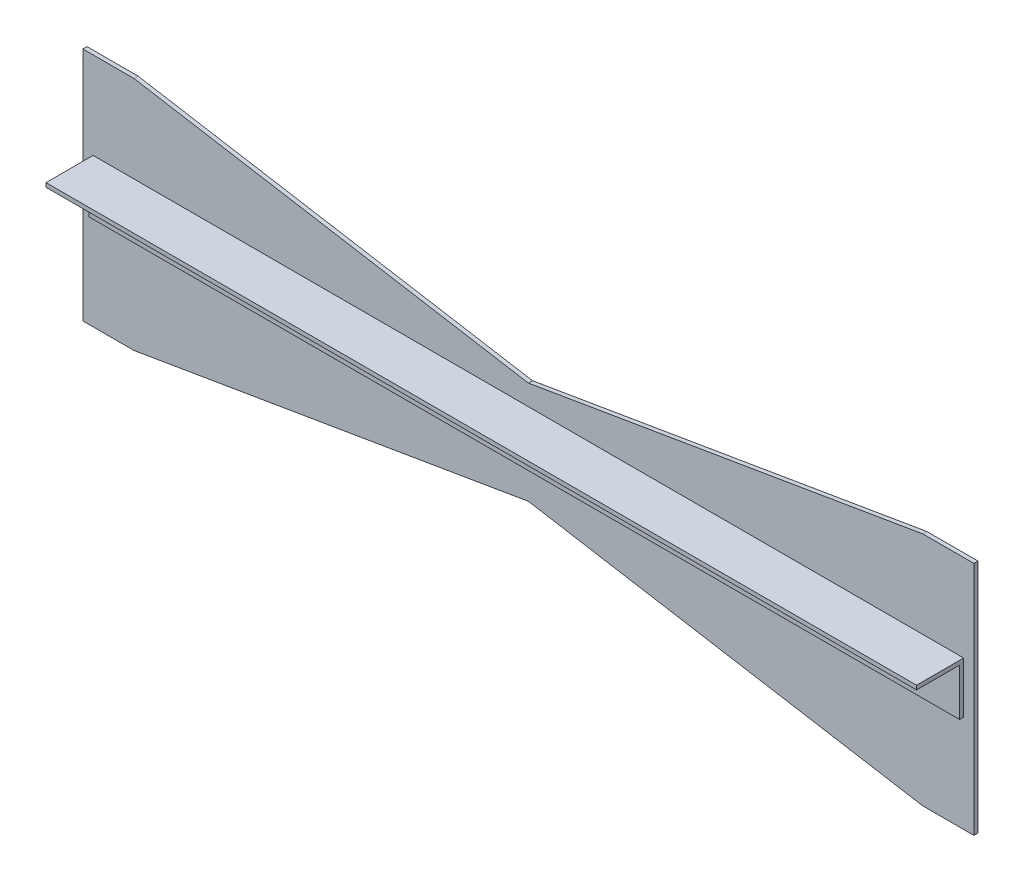
ISO-10303-21;
HEADER;
FILE_DESCRIPTION(('STEP AP214'),'2;1');
FILE_NAME('part.step','',(''),(''),'','','');
FILE_SCHEMA(('AUTOMOTIVE_DESIGN { 1 0 10303 214 1 1 1 1 }'));
ENDSEC;
DATA;
#1=APPLICATION_CONTEXT('core data for automotive mechanical design processes');
#2=APPLICATION_PROTOCOL_DEFINITION('international standard','automotive_design',2000,#1);
#3=PRODUCT_CONTEXT('',#1,'mechanical');
#4=PRODUCT('Part','Part','',(#3));
#5=PRODUCT_RELATED_PRODUCT_CATEGORY('part','',(#4));
#6=PRODUCT_DEFINITION_FORMATION('','',#4);
#7=PRODUCT_DEFINITION_CONTEXT('part definition',#1,'design');
#8=PRODUCT_DEFINITION('design','',#6,#7);
#9=PRODUCT_DEFINITION_SHAPE('','',#8);
#10=(LENGTH_UNIT() NAMED_UNIT(*) SI_UNIT(.MILLI.,.METRE.));
#11=(NAMED_UNIT(*) PLANE_ANGLE_UNIT() SI_UNIT($,.RADIAN.));
#12=(NAMED_UNIT(*) SI_UNIT($,.STERADIAN.) SOLID_ANGLE_UNIT());
#13=UNCERTAINTY_MEASURE_WITH_UNIT(LENGTH_MEASURE(1.E-05),#10,'distance_accuracy_value','');
#14=(GEOMETRIC_REPRESENTATION_CONTEXT(3) GLOBAL_UNCERTAINTY_ASSIGNED_CONTEXT((#13)) GLOBAL_UNIT_ASSIGNED_CONTEXT((#10,
#11,#12)) REPRESENTATION_CONTEXT('',''));
#15=CARTESIAN_POINT('',(0.,0.,0.));
#16=DIRECTION('',(0.,0.,1.));
#17=DIRECTION('',(1.,0.,0.));
#18=AXIS2_PLACEMENT_3D('',#15,#16,#17);
#19=CARTESIAN_POINT('',(-870.,0.,8.));
#20=DIRECTION('',(0.,0.,-1.));
#21=DIRECTION('',(-1.,0.,0.));
#22=AXIS2_PLACEMENT_3D('',#19,#20,#21);
#23=PLANE('',#22);
#24=DIRECTION('',(-1.,0.,0.));
#25=VECTOR('',#24,1.);
#26=CARTESIAN_POINT('',(0.,60.,8.));
#27=LINE('',#26,#25);
#28=CARTESIAN_POINT('',(849.999999999997,60.0000000000011,8.));
#29=VERTEX_POINT('',#28);
#30=CARTESIAN_POINT('',(-849.999999999997,60.0000000000011,8.));
#31=VERTEX_POINT('',#30);
#32=EDGE_CURVE('E233',#29,#31,#27,.T.);
#33=ORIENTED_EDGE('',*,*,#32,.F.);
#34=DIRECTION('',(0.,-1.,0.));
#35=VECTOR('',#34,1.);
#36=CARTESIAN_POINT('',(849.999999999997,60.0000000000011,8.));
#37=LINE('',#36,#35);
#38=CARTESIAN_POINT('',(849.999999999997,-39.999999999996,8.));
#39=VERTEX_POINT('',#38);
#40=EDGE_CURVE('E162',#29,#39,#37,.T.);
#41=ORIENTED_EDGE('',*,*,#40,.T.);
#42=DIRECTION('',(1.,0.,0.));
#43=VECTOR('',#42,1.);
#44=CARTESIAN_POINT('',(-849.999999999997,-39.999999999996,8.));
#45=LINE('',#44,#43);
#46=CARTESIAN_POINT('',(-849.999999999997,-39.999999999996,8.));
#47=VERTEX_POINT('',#46);
#48=EDGE_CURVE('E228',#47,#39,#45,.T.);
#49=ORIENTED_EDGE('',*,*,#48,.F.);
#50=DIRECTION('',(0.,-1.,0.));
#51=VECTOR('',#50,1.);
#52=CARTESIAN_POINT('',(-849.999999999997,60.0000000000011,8.));
#53=LINE('',#52,#51);
#54=EDGE_CURVE('E226',#31,#47,#53,.T.);
#55=ORIENTED_EDGE('',*,*,#54,.F.);
#56=EDGE_LOOP('',(#33,#41,#49,#55));
#57=FACE_BOUND('',#56,.T.);
#58=DIRECTION('',(-0.986045635560713,-0.166475237172591,0.));
#59=VECTOR('',#58,1.);
#60=CARTESIAN_POINT('',(-770.,-230.,8.));
#61=LINE('',#60,#59);
#62=CARTESIAN_POINT('',(1.74574168055479E-13,-99.9999999999972,8.));
#63=VERTEX_POINT('',#62);
#64=CARTESIAN_POINT('',(-770.,-230.,8.));
#65=VERTEX_POINT('',#64);
#66=EDGE_CURVE('E260',#63,#65,#61,.T.);
#67=ORIENTED_EDGE('',*,*,#66,.F.);
#68=DIRECTION('',(0.986045635560713,-0.166475237172591,0.));
#69=VECTOR('',#68,1.);
#70=CARTESIAN_POINT('',(770.,-230.,8.));
#71=LINE('',#70,#69);
#72=CARTESIAN_POINT('',(770.,-230.,8.));
#73=VERTEX_POINT('',#72);
#74=EDGE_CURVE('E180',#63,#73,#71,.T.);
#75=ORIENTED_EDGE('',*,*,#74,.T.);
#76=DIRECTION('',(1.,0.,0.));
#77=VECTOR('',#76,1.);
#78=CARTESIAN_POINT('',(870.,-230.,8.));
#79=LINE('',#78,#77);
#80=CARTESIAN_POINT('',(870.,-230.,8.));
#81=VERTEX_POINT('',#80);
#82=EDGE_CURVE('E182',#73,#81,#79,.T.);
#83=ORIENTED_EDGE('',*,*,#82,.T.);
#84=DIRECTION('',(0.,-1.,0.));
#85=VECTOR('',#84,1.);
#86=CARTESIAN_POINT('',(870.,0.,8.));
#87=LINE('',#86,#85);
#88=CARTESIAN_POINT('',(870.,230.,8.));
#89=VERTEX_POINT('',#88);
#90=EDGE_CURVE('E196',#89,#81,#87,.T.);
#91=ORIENTED_EDGE('',*,*,#90,.F.);
#92=DIRECTION('',(1.,0.,0.));
#93=VECTOR('',#92,1.);
#94=CARTESIAN_POINT('',(870.,230.,8.));
#95=LINE('',#94,#93);
#96=CARTESIAN_POINT('',(770.,230.,8.));
#97=VERTEX_POINT('',#96);
#98=EDGE_CURVE('E198',#97,#89,#95,.T.);
#99=ORIENTED_EDGE('',*,*,#98,.F.);
#100=DIRECTION('',(0.986045635560713,0.166475237172591,0.));
#101=VECTOR('',#100,1.);
#102=CARTESIAN_POINT('',(770.,230.,8.));
#103=LINE('',#102,#101);
#104=CARTESIAN_POINT('',(-1.74574168055479E-13,99.9999999999972,8.));
#105=VERTEX_POINT('',#104);
#106=EDGE_CURVE('E202',#105,#97,#103,.T.);
#107=ORIENTED_EDGE('',*,*,#106,.F.);
#108=DIRECTION('',(-0.986045635560713,0.166475237172591,0.));
#109=VECTOR('',#108,1.);
#110=CARTESIAN_POINT('',(-770.,230.,8.));
#111=LINE('',#110,#109);
#112=CARTESIAN_POINT('',(-770.,230.,8.));
#113=VERTEX_POINT('',#112);
#114=EDGE_CURVE('E273',#105,#113,#111,.T.);
#115=ORIENTED_EDGE('',*,*,#114,.T.);
#116=DIRECTION('',(-1.,0.,0.));
#117=VECTOR('',#116,1.);
#118=CARTESIAN_POINT('',(-870.,230.,8.));
#119=LINE('',#118,#117);
#120=CARTESIAN_POINT('',(-870.,230.,8.));
#121=VERTEX_POINT('',#120);
#122=EDGE_CURVE('E275',#113,#121,#119,.T.);
#123=ORIENTED_EDGE('',*,*,#122,.T.);
#124=DIRECTION('',(0.,-1.,0.));
#125=VECTOR('',#124,1.);
#126=CARTESIAN_POINT('',(-870.,0.,8.));
#127=LINE('',#126,#125);
#128=CARTESIAN_POINT('',(-870.,-230.,8.));
#129=VERTEX_POINT('',#128);
#130=EDGE_CURVE('E278',#121,#129,#127,.T.);
#131=ORIENTED_EDGE('',*,*,#130,.T.);
#132=DIRECTION('',(-1.,0.,0.));
#133=VECTOR('',#132,1.);
#134=CARTESIAN_POINT('',(-870.,-230.,8.));
#135=LINE('',#134,#133);
#136=EDGE_CURVE('E257',#65,#129,#135,.T.);
#137=ORIENTED_EDGE('',*,*,#136,.F.);
#138=EDGE_LOOP('',(#67,#75,#83,#91,#99,#107,#115,#123,#131,#137));
#139=FACE_BOUND('',#138,.T.);
#140=ADVANCED_FACE('F34',(#57,#139),#23,.F.);
#141=CARTESIAN_POINT('',(-770.,230.,8.));
#142=DIRECTION('',(-0.166475237172591,-0.986045635560712,0.));
#143=DIRECTION('',(0.986045635560712,-0.166475237172591,0.));
#144=AXIS2_PLACEMENT_3D('',#141,#142,#143);
#145=PLANE('',#144);
#146=DIRECTION('',(-0.986045635560713,0.166475237172591,0.));
#147=VECTOR('',#146,1.);
#148=CARTESIAN_POINT('',(-770.,230.,0.));
#149=LINE('',#148,#147);
#150=CARTESIAN_POINT('',(1.74574168055479E-13,99.9999999999972,0.));
#151=VERTEX_POINT('',#150);
#152=CARTESIAN_POINT('',(-770.,230.,0.));
#153=VERTEX_POINT('',#152);
#154=EDGE_CURVE('E272',#151,#153,#149,.T.);
#155=ORIENTED_EDGE('',*,*,#154,.T.);
#156=DIRECTION('',(0.,0.,-1.));
#157=VECTOR('',#156,1.);
#158=CARTESIAN_POINT('',(-770.,230.,8.));
#159=LINE('',#158,#157);
#160=EDGE_CURVE('E43',#113,#153,#159,.T.);
#161=ORIENTED_EDGE('',*,*,#160,.F.);
#162=ORIENTED_EDGE('',*,*,#114,.F.);
#163=DIRECTION('',(0.,0.,-1.));
#164=VECTOR('',#163,1.);
#165=CARTESIAN_POINT('',(-1.74574168055479E-13,99.9999999999972,8.));
#166=LINE('',#165,#164);
#167=EDGE_CURVE('E11',#105,#151,#166,.T.);
#168=ORIENTED_EDGE('',*,*,#167,.T.);
#169=EDGE_LOOP('',(#155,#161,#162,#168));
#170=FACE_BOUND('',#169,.T.);
#171=ADVANCED_FACE('F36',(#170),#145,.F.);
#172=CARTESIAN_POINT('',(-870.,230.,8.));
#173=DIRECTION('',(0.,-1.,0.));
#174=DIRECTION('',(0.,0.,-1.));
#175=AXIS2_PLACEMENT_3D('',#172,#173,#174);
#176=PLANE('',#175);
#177=DIRECTION('',(-1.,0.,0.));
#178=VECTOR('',#177,1.);
#179=CARTESIAN_POINT('',(-870.,230.,0.));
#180=LINE('',#179,#178);
#181=CARTESIAN_POINT('',(-870.,230.,0.));
#182=VERTEX_POINT('',#181);
#183=EDGE_CURVE('E282',#153,#182,#180,.T.);
#184=ORIENTED_EDGE('',*,*,#183,.T.);
#185=DIRECTION('',(0.,0.,-1.));
#186=VECTOR('',#185,1.);
#187=CARTESIAN_POINT('',(-870.,230.,8.));
#188=LINE('',#187,#186);
#189=EDGE_CURVE('E280',#121,#182,#188,.T.);
#190=ORIENTED_EDGE('',*,*,#189,.F.);
#191=ORIENTED_EDGE('',*,*,#122,.F.);
#192=ORIENTED_EDGE('',*,*,#160,.T.);
#193=EDGE_LOOP('',(#184,#190,#191,#192));
#194=FACE_BOUND('',#193,.T.);
#195=ADVANCED_FACE('F291',(#194),#176,.F.);
#196=CARTESIAN_POINT('',(-870.,0.,8.));
#197=DIRECTION('',(1.,0.,0.));
#198=DIRECTION('',(0.,0.,-1.));
#199=AXIS2_PLACEMENT_3D('',#196,#197,#198);
#200=PLANE('',#199);
#201=DIRECTION('',(0.,-1.,0.));
#202=VECTOR('',#201,1.);
#203=CARTESIAN_POINT('',(-870.,0.,0.));
#204=LINE('',#203,#202);
#205=CARTESIAN_POINT('',(-870.,-230.,0.));
#206=VERTEX_POINT('',#205);
#207=EDGE_CURVE('E276',#182,#206,#204,.T.);
#208=ORIENTED_EDGE('',*,*,#207,.T.);
#209=DIRECTION('',(0.,0.,-1.));
#210=VECTOR('',#209,1.);
#211=CARTESIAN_POINT('',(-870.,-230.,8.));
#212=LINE('',#211,#210);
#213=EDGE_CURVE('E269',#129,#206,#212,.T.);
#214=ORIENTED_EDGE('',*,*,#213,.F.);
#215=ORIENTED_EDGE('',*,*,#130,.F.);
#216=ORIENTED_EDGE('',*,*,#189,.T.);
#217=EDGE_LOOP('',(#208,#214,#215,#216));
#218=FACE_BOUND('',#217,.T.);
#219=ADVANCED_FACE('F303',(#218),#200,.F.);
#220=CARTESIAN_POINT('',(-870.,0.,0.));
#221=DIRECTION('',(0.,0.,-1.));
#222=DIRECTION('',(-1.,0.,0.));
#223=AXIS2_PLACEMENT_3D('',#220,#221,#222);
#224=PLANE('',#223);
#225=DIRECTION('',(0.986045635560713,-0.166475237172591,0.));
#226=VECTOR('',#225,1.);
#227=CARTESIAN_POINT('',(770.,-230.,0.));
#228=LINE('',#227,#226);
#229=CARTESIAN_POINT('',(1.74574168055479E-13,-99.9999999999972,0.));
#230=VERTEX_POINT('',#229);
#231=CARTESIAN_POINT('',(770.,-230.,0.));
#232=VERTEX_POINT('',#231);
#233=EDGE_CURVE('E179',#230,#232,#228,.T.);
#234=ORIENTED_EDGE('',*,*,#233,.F.);
#235=DIRECTION('',(-0.986045635560713,-0.166475237172591,0.));
#236=VECTOR('',#235,1.);
#237=CARTESIAN_POINT('',(-770.,-230.,0.));
#238=LINE('',#237,#236);
#239=CARTESIAN_POINT('',(-770.,-230.,0.));
#240=VERTEX_POINT('',#239);
#241=EDGE_CURVE('E254',#230,#240,#238,.T.);
#242=ORIENTED_EDGE('',*,*,#241,.T.);
#243=DIRECTION('',(-1.,0.,0.));
#244=VECTOR('',#243,1.);
#245=CARTESIAN_POINT('',(-870.,-230.,0.));
#246=LINE('',#245,#244);
#247=EDGE_CURVE('E251',#240,#206,#246,.T.);
#248=ORIENTED_EDGE('',*,*,#247,.T.);
#249=ORIENTED_EDGE('',*,*,#207,.F.);
#250=ORIENTED_EDGE('',*,*,#183,.F.);
#251=ORIENTED_EDGE('',*,*,#154,.F.);
#252=DIRECTION('',(0.986045635560713,0.166475237172591,0.));
#253=VECTOR('',#252,1.);
#254=CARTESIAN_POINT('',(770.,230.,0.));
#255=LINE('',#254,#253);
#256=CARTESIAN_POINT('',(770.,230.,0.));
#257=VERTEX_POINT('',#256);
#258=EDGE_CURVE('E199',#151,#257,#255,.T.);
#259=ORIENTED_EDGE('',*,*,#258,.T.);
#260=DIRECTION('',(1.,0.,0.));
#261=VECTOR('',#260,1.);
#262=CARTESIAN_POINT('',(870.,230.,0.));
#263=LINE('',#262,#261);
#264=CARTESIAN_POINT('',(870.,230.,0.));
#265=VERTEX_POINT('',#264);
#266=EDGE_CURVE('E207',#257,#265,#263,.T.);
#267=ORIENTED_EDGE('',*,*,#266,.T.);
#268=DIRECTION('',(0.,-1.,0.));
#269=VECTOR('',#268,1.);
#270=CARTESIAN_POINT('',(870.,0.,0.));
#271=LINE('',#270,#269);
#272=CARTESIAN_POINT('',(870.,-230.,0.));
#273=VERTEX_POINT('',#272);
#274=EDGE_CURVE('E195',#265,#273,#271,.T.);
#275=ORIENTED_EDGE('',*,*,#274,.T.);
#276=DIRECTION('',(1.,0.,0.));
#277=VECTOR('',#276,1.);
#278=CARTESIAN_POINT('',(870.,-230.,0.));
#279=LINE('',#278,#277);
#280=EDGE_CURVE('E183',#232,#273,#279,.T.);
#281=ORIENTED_EDGE('',*,*,#280,.F.);
#282=EDGE_LOOP('',(#234,#242,#248,#249,#250,#251,#259,#267,#275,#281));
#283=FACE_BOUND('',#282,.T.);
#284=ADVANCED_FACE('F299',(#283),#224,.T.);
#285=CARTESIAN_POINT('',(-870.,-230.,8.));
#286=DIRECTION('',(0.,-1.,0.));
#287=DIRECTION('',(0.,0.,-1.));
#288=AXIS2_PLACEMENT_3D('',#285,#286,#287);
#289=PLANE('',#288);
#290=ORIENTED_EDGE('',*,*,#247,.F.);
#291=DIRECTION('',(0.,0.,-1.));
#292=VECTOR('',#291,1.);
#293=CARTESIAN_POINT('',(-770.,-230.,8.));
#294=LINE('',#293,#292);
#295=EDGE_CURVE('E267',#65,#240,#294,.T.);
#296=ORIENTED_EDGE('',*,*,#295,.F.);
#297=ORIENTED_EDGE('',*,*,#136,.T.);
#298=ORIENTED_EDGE('',*,*,#213,.T.);
#299=EDGE_LOOP('',(#290,#296,#297,#298));
#300=FACE_BOUND('',#299,.T.);
#301=ADVANCED_FACE('F306',(#300),#289,.T.);
#302=CARTESIAN_POINT('',(-770.,-230.,8.));
#303=DIRECTION('',(0.166475237172591,-0.986045635560712,0.));
#304=DIRECTION('',(0.986045635560712,0.166475237172591,0.));
#305=AXIS2_PLACEMENT_3D('',#302,#303,#304);
#306=PLANE('',#305);
#307=ORIENTED_EDGE('',*,*,#241,.F.);
#308=DIRECTION('',(0.,0.,-1.));
#309=VECTOR('',#308,1.);
#310=CARTESIAN_POINT('',(-1.74574168055479E-13,-99.9999999999972,8.));
#311=LINE('',#310,#309);
#312=EDGE_CURVE('E262',#63,#230,#311,.T.);
#313=ORIENTED_EDGE('',*,*,#312,.F.);
#314=ORIENTED_EDGE('',*,*,#66,.T.);
#315=ORIENTED_EDGE('',*,*,#295,.T.);
#316=EDGE_LOOP('',(#307,#313,#314,#315));
#317=FACE_BOUND('',#316,.T.);
#318=ADVANCED_FACE('F313',(#317),#306,.T.);
#319=CARTESIAN_POINT('',(-849.999999999997,60.0000000000011,16.));
#320=DIRECTION('',(1.,0.,0.));
#321=DIRECTION('',(0.,0.,-1.));
#322=AXIS2_PLACEMENT_3D('',#319,#320,#321);
#323=PLANE('',#322);
#324=ORIENTED_EDGE('',*,*,#54,.T.);
#325=DIRECTION('',(0.,0.,-1.));
#326=VECTOR('',#325,1.);
#327=CARTESIAN_POINT('',(-849.999999999997,-39.999999999996,16.));
#328=LINE('',#327,#326);
#329=CARTESIAN_POINT('',(-849.999999999997,-39.999999999996,16.));
#330=VERTEX_POINT('',#329);
#331=EDGE_CURVE('E249',#330,#47,#328,.T.);
#332=ORIENTED_EDGE('',*,*,#331,.F.);
#333=DIRECTION('',(0.,-1.,0.));
#334=VECTOR('',#333,1.);
#335=CARTESIAN_POINT('',(-849.999999999997,60.0000000000011,16.));
#336=LINE('',#335,#334);
#337=CARTESIAN_POINT('',(-849.999999999997,52.0000000000006,16.));
#338=VERTEX_POINT('',#337);
#339=EDGE_CURVE('E224',#338,#330,#336,.T.);
#340=ORIENTED_EDGE('',*,*,#339,.F.);
#341=DIRECTION('',(0.,0.,-1.));
#342=VECTOR('',#341,1.);
#343=CARTESIAN_POINT('',(-849.999999999997,52.0000000000006,100.));
#344=LINE('',#343,#342);
#345=CARTESIAN_POINT('',(-849.999999999997,52.0000000000006,100.));
#346=VERTEX_POINT('',#345);
#347=EDGE_CURVE('E217',#346,#338,#344,.T.);
#348=ORIENTED_EDGE('',*,*,#347,.F.);
#349=DIRECTION('',(0.,-1.,0.));
#350=VECTOR('',#349,1.);
#351=CARTESIAN_POINT('',(-849.999999999997,60.0000000000011,100.));
#352=LINE('',#351,#350);
#353=CARTESIAN_POINT('',(-849.999999999997,60.0000000000011,100.));
#354=VERTEX_POINT('',#353);
#355=EDGE_CURVE('E155',#354,#346,#352,.T.);
#356=ORIENTED_EDGE('',*,*,#355,.F.);
#357=DIRECTION('',(0.,0.,-1.));
#358=VECTOR('',#357,1.);
#359=CARTESIAN_POINT('',(-849.999999999997,60.0000000000011,16.));
#360=LINE('',#359,#358);
#361=EDGE_CURVE('E239',#354,#31,#360,.T.);
#362=ORIENTED_EDGE('',*,*,#361,.T.);
#363=EDGE_LOOP('',(#324,#332,#340,#348,#356,#362));
#364=FACE_BOUND('',#363,.T.);
#365=ADVANCED_FACE('F369',(#364),#323,.F.);
#366=CARTESIAN_POINT('',(-849.999999999997,-39.999999999996,16.));
#367=DIRECTION('',(0.,1.,0.));
#368=DIRECTION('',(-1.,0.,0.));
#369=AXIS2_PLACEMENT_3D('',#366,#367,#368);
#370=PLANE('',#369);
#371=ORIENTED_EDGE('',*,*,#48,.T.);
#372=DIRECTION('',(0.,0.,-1.));
#373=VECTOR('',#372,1.);
#374=CARTESIAN_POINT('',(849.999999999997,-39.999999999996,16.));
#375=LINE('',#374,#373);
#376=CARTESIAN_POINT('',(849.999999999997,-39.999999999996,16.));
#377=VERTEX_POINT('',#376);
#378=EDGE_CURVE('E173',#377,#39,#375,.T.);
#379=ORIENTED_EDGE('',*,*,#378,.F.);
#380=DIRECTION('',(1.,0.,0.));
#381=VECTOR('',#380,1.);
#382=CARTESIAN_POINT('',(-849.999999999997,-39.999999999996,16.));
#383=LINE('',#382,#381);
#384=EDGE_CURVE('E236',#330,#377,#383,.T.);
#385=ORIENTED_EDGE('',*,*,#384,.F.);
#386=ORIENTED_EDGE('',*,*,#331,.T.);
#387=EDGE_LOOP('',(#371,#379,#385,#386));
#388=FACE_BOUND('',#387,.T.);
#389=ADVANCED_FACE('F375',(#388),#370,.F.);
#390=CARTESIAN_POINT('',(0.,60.,16.));
#391=DIRECTION('',(0.,-1.,0.));
#392=DIRECTION('',(1.,0.,0.));
#393=AXIS2_PLACEMENT_3D('',#390,#391,#392);
#394=PLANE('',#393);
#395=ORIENTED_EDGE('',*,*,#32,.T.);
#396=ORIENTED_EDGE('',*,*,#361,.F.);
#397=DIRECTION('',(-1.,0.,0.));
#398=VECTOR('',#397,1.);
#399=CARTESIAN_POINT('',(-1.04744500833291E-13,60.0000000000006,100.));
#400=LINE('',#399,#398);
#401=CARTESIAN_POINT('',(849.999999999997,60.0000000000011,100.));
#402=VERTEX_POINT('',#401);
#403=EDGE_CURVE('E157',#402,#354,#400,.T.);
#404=ORIENTED_EDGE('',*,*,#403,.F.);
#405=DIRECTION('',(0.,0.,-1.));
#406=VECTOR('',#405,1.);
#407=CARTESIAN_POINT('',(849.999999999997,60.0000000000011,16.));
#408=LINE('',#407,#406);
#409=EDGE_CURVE('E168',#402,#29,#408,.T.);
#410=ORIENTED_EDGE('',*,*,#409,.T.);
#411=EDGE_LOOP('',(#395,#396,#404,#410));
#412=FACE_BOUND('',#411,.T.);
#413=ADVANCED_FACE('F381',(#412),#394,.F.);
#414=CARTESIAN_POINT('',(-849.999999999997,-39.999999999996,16.));
#415=DIRECTION('',(0.,0.,1.));
#416=DIRECTION('',(1.,0.,0.));
#417=AXIS2_PLACEMENT_3D('',#414,#415,#416);
#418=PLANE('',#417);
#419=DIRECTION('',(0.,-1.,0.));
#420=VECTOR('',#419,1.);
#421=CARTESIAN_POINT('',(849.999999999997,60.0000000000011,16.));
#422=LINE('',#421,#420);
#423=CARTESIAN_POINT('',(849.999999999997,52.0000000000006,16.));
#424=VERTEX_POINT('',#423);
#425=EDGE_CURVE('E171',#424,#377,#422,.T.);
#426=ORIENTED_EDGE('',*,*,#425,.F.);
#427=DIRECTION('',(1.,0.,0.));
#428=VECTOR('',#427,1.);
#429=CARTESIAN_POINT('',(-849.999999999997,52.0000000000006,16.));
#430=LINE('',#429,#428);
#431=EDGE_CURVE('E51',#338,#424,#430,.T.);
#432=ORIENTED_EDGE('',*,*,#431,.F.);
#433=ORIENTED_EDGE('',*,*,#339,.T.);
#434=ORIENTED_EDGE('',*,*,#384,.T.);
#435=EDGE_LOOP('',(#426,#432,#433,#434));
#436=FACE_BOUND('',#435,.T.);
#437=ADVANCED_FACE('F388',(#436),#418,.T.);
#438=CARTESIAN_POINT('',(-849.999999999997,52.0000000000006,100.));
#439=DIRECTION('',(0.,1.,0.));
#440=DIRECTION('',(0.,0.,1.));
#441=AXIS2_PLACEMENT_3D('',#438,#439,#440);
#442=PLANE('',#441);
#443=ORIENTED_EDGE('',*,*,#431,.T.);
#444=DIRECTION('',(0.,0.,-1.));
#445=VECTOR('',#444,1.);
#446=CARTESIAN_POINT('',(849.999999999997,52.0000000000006,100.));
#447=LINE('',#446,#445);
#448=CARTESIAN_POINT('',(849.999999999997,52.0000000000006,100.));
#449=VERTEX_POINT('',#448);
#450=EDGE_CURVE('E159',#449,#424,#447,.T.);
#451=ORIENTED_EDGE('',*,*,#450,.F.);
#452=DIRECTION('',(1.,0.,0.));
#453=VECTOR('',#452,1.);
#454=CARTESIAN_POINT('',(-849.999999999997,52.0000000000006,100.));
#455=LINE('',#454,#453);
#456=EDGE_CURVE('E149',#346,#449,#455,.T.);
#457=ORIENTED_EDGE('',*,*,#456,.F.);
#458=ORIENTED_EDGE('',*,*,#347,.T.);
#459=EDGE_LOOP('',(#443,#451,#457,#458));
#460=FACE_BOUND('',#459,.T.);
#461=ADVANCED_FACE('F160',(#460),#442,.F.);
#462=CARTESIAN_POINT('',(0.,52.0000000000006,100.));
#463=DIRECTION('',(0.,0.,1.));
#464=DIRECTION('',(1.,0.,0.));
#465=AXIS2_PLACEMENT_3D('',#462,#463,#464);
#466=PLANE('',#465);
#467=ORIENTED_EDGE('',*,*,#456,.T.);
#468=DIRECTION('',(0.,-1.,0.));
#469=VECTOR('',#468,1.);
#470=CARTESIAN_POINT('',(849.999999999997,60.0000000000011,100.));
#471=LINE('',#470,#469);
#472=EDGE_CURVE('E153',#402,#449,#471,.T.);
#473=ORIENTED_EDGE('',*,*,#472,.F.);
#474=ORIENTED_EDGE('',*,*,#403,.T.);
#475=ORIENTED_EDGE('',*,*,#355,.T.);
#476=EDGE_LOOP('',(#467,#473,#474,#475));
#477=FACE_BOUND('',#476,.T.);
#478=ADVANCED_FACE('F150',(#477),#466,.T.);
#479=CARTESIAN_POINT('',(870.,0.,8.));
#480=DIRECTION('',(1.,0.,0.));
#481=DIRECTION('',(0.,0.,-1.));
#482=AXIS2_PLACEMENT_3D('',#479,#480,#481);
#483=PLANE('',#482);
#484=ORIENTED_EDGE('',*,*,#274,.F.);
#485=DIRECTION('',(0.,0.,-1.));
#486=VECTOR('',#485,1.);
#487=CARTESIAN_POINT('',(870.,230.,8.));
#488=LINE('',#487,#486);
#489=EDGE_CURVE('E213',#89,#265,#488,.T.);
#490=ORIENTED_EDGE('',*,*,#489,.F.);
#491=ORIENTED_EDGE('',*,*,#90,.T.);
#492=DIRECTION('',(0.,0.,-1.));
#493=VECTOR('',#492,1.);
#494=CARTESIAN_POINT('',(870.,-230.,8.));
#495=LINE('',#494,#493);
#496=EDGE_CURVE('E186',#81,#273,#495,.T.);
#497=ORIENTED_EDGE('',*,*,#496,.T.);
#498=EDGE_LOOP('',(#484,#490,#491,#497));
#499=FACE_BOUND('',#498,.T.);
#500=ADVANCED_FACE('F324',(#499),#483,.T.);
#501=CARTESIAN_POINT('',(870.,230.,8.));
#502=DIRECTION('',(0.,1.,0.));
#503=DIRECTION('',(0.,0.,1.));
#504=AXIS2_PLACEMENT_3D('',#501,#502,#503);
#505=PLANE('',#504);
#506=ORIENTED_EDGE('',*,*,#266,.F.);
#507=DIRECTION('',(0.,0.,-1.));
#508=VECTOR('',#507,1.);
#509=CARTESIAN_POINT('',(770.,230.,8.));
#510=LINE('',#509,#508);
#511=EDGE_CURVE('E205',#97,#257,#510,.T.);
#512=ORIENTED_EDGE('',*,*,#511,.F.);
#513=ORIENTED_EDGE('',*,*,#98,.T.);
#514=ORIENTED_EDGE('',*,*,#489,.T.);
#515=EDGE_LOOP('',(#506,#512,#513,#514));
#516=FACE_BOUND('',#515,.T.);
#517=ADVANCED_FACE('F329',(#516),#505,.T.);
#518=CARTESIAN_POINT('',(770.,230.,8.));
#519=DIRECTION('',(-0.166475237172591,0.986045635560712,0.));
#520=DIRECTION('',(-0.986045635560712,-0.166475237172591,0.));
#521=AXIS2_PLACEMENT_3D('',#518,#519,#520);
#522=PLANE('',#521);
#523=ORIENTED_EDGE('',*,*,#258,.F.);
#524=ORIENTED_EDGE('',*,*,#167,.F.);
#525=ORIENTED_EDGE('',*,*,#106,.T.);
#526=ORIENTED_EDGE('',*,*,#511,.T.);
#527=EDGE_LOOP('',(#523,#524,#525,#526));
#528=FACE_BOUND('',#527,.T.);
#529=ADVANCED_FACE('F331',(#528),#522,.T.);
#530=CARTESIAN_POINT('',(770.,-230.,8.));
#531=DIRECTION('',(0.166475237172591,0.986045635560712,0.));
#532=DIRECTION('',(-0.986045635560712,0.166475237172591,0.));
#533=AXIS2_PLACEMENT_3D('',#530,#531,#532);
#534=PLANE('',#533);
#535=ORIENTED_EDGE('',*,*,#233,.T.);
#536=DIRECTION('',(0.,0.,-1.));
#537=VECTOR('',#536,1.);
#538=CARTESIAN_POINT('',(770.,-230.,8.));
#539=LINE('',#538,#537);
#540=EDGE_CURVE('E192',#73,#232,#539,.T.);
#541=ORIENTED_EDGE('',*,*,#540,.F.);
#542=ORIENTED_EDGE('',*,*,#74,.F.);
#543=ORIENTED_EDGE('',*,*,#312,.T.);
#544=EDGE_LOOP('',(#535,#541,#542,#543));
#545=FACE_BOUND('',#544,.T.);
#546=ADVANCED_FACE('F315',(#545),#534,.F.);
#547=CARTESIAN_POINT('',(870.,-230.,8.));
#548=DIRECTION('',(0.,1.,0.));
#549=DIRECTION('',(0.,0.,1.));
#550=AXIS2_PLACEMENT_3D('',#547,#548,#549);
#551=PLANE('',#550);
#552=ORIENTED_EDGE('',*,*,#280,.T.);
#553=ORIENTED_EDGE('',*,*,#496,.F.);
#554=ORIENTED_EDGE('',*,*,#82,.F.);
#555=ORIENTED_EDGE('',*,*,#540,.T.);
#556=EDGE_LOOP('',(#552,#553,#554,#555));
#557=FACE_BOUND('',#556,.T.);
#558=ADVANCED_FACE('F321',(#557),#551,.F.);
#559=CARTESIAN_POINT('',(849.999999999997,60.0000000000011,16.));
#560=DIRECTION('',(1.,0.,0.));
#561=DIRECTION('',(0.,0.,-1.));
#562=AXIS2_PLACEMENT_3D('',#559,#560,#561);
#563=PLANE('',#562);
#564=ORIENTED_EDGE('',*,*,#40,.F.);
#565=ORIENTED_EDGE('',*,*,#409,.F.);
#566=ORIENTED_EDGE('',*,*,#472,.T.);
#567=ORIENTED_EDGE('',*,*,#450,.T.);
#568=ORIENTED_EDGE('',*,*,#425,.T.);
#569=ORIENTED_EDGE('',*,*,#378,.T.);
#570=EDGE_LOOP('',(#564,#565,#566,#567,#568,#569));
#571=FACE_BOUND('',#570,.T.);
#572=ADVANCED_FACE('F166',(#571),#563,.T.);
#573=CLOSED_SHELL('',(#140,#171,#195,#219,#284,#301,#318,#365,#389,#413,#437,#461,#478,#500,
#517,#529,#546,#558,#572));
#574=MANIFOLD_SOLID_BREP('B2',#573);
#575=ADVANCED_BREP_SHAPE_REPRESENTATION('',(#18,#574),#14);
#576=SHAPE_DEFINITION_REPRESENTATION(#9,#575);
ENDSEC;
END-ISO-10303-21;
